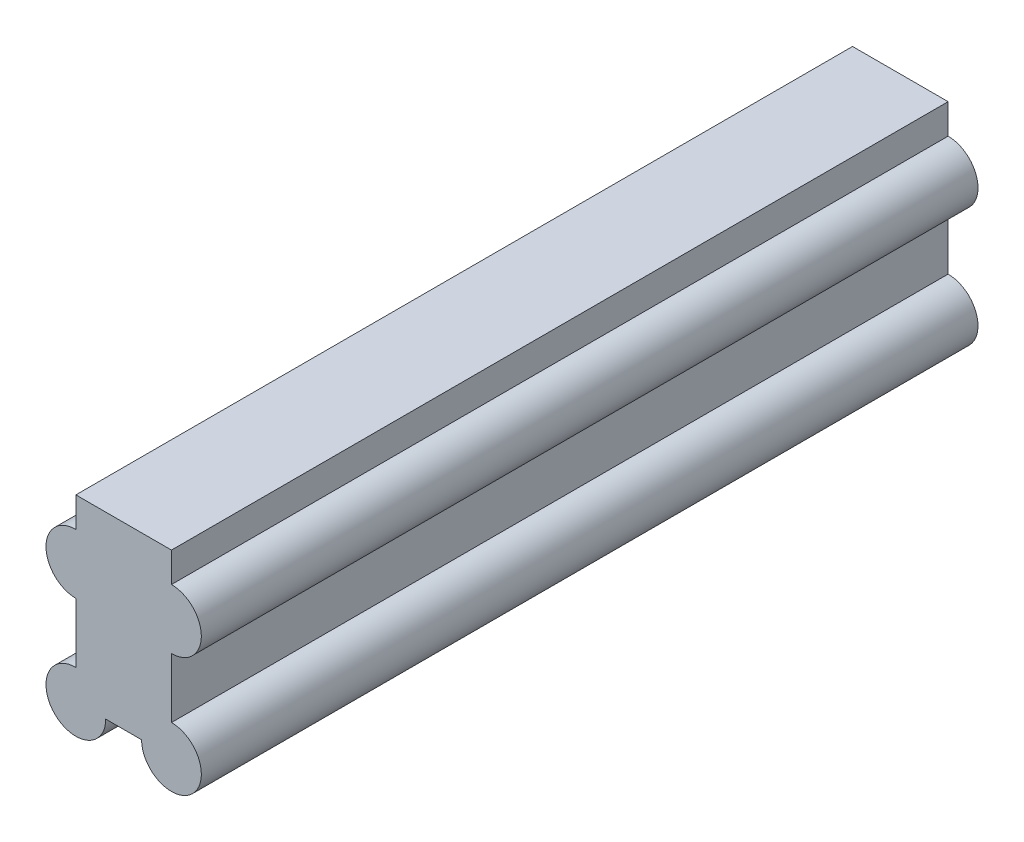
ISO-10303-21;
HEADER;
FILE_DESCRIPTION(('STEP AP214'),'2;1');
FILE_NAME('part.step','',(''),(''),'','','');
FILE_SCHEMA(('AUTOMOTIVE_DESIGN { 1 0 10303 214 1 1 1 1 }'));
ENDSEC;
DATA;
#1=APPLICATION_CONTEXT('core data for automotive mechanical design processes');
#2=APPLICATION_PROTOCOL_DEFINITION('international standard','automotive_design',2000,#1);
#3=PRODUCT_CONTEXT('',#1,'mechanical');
#4=PRODUCT('Part','Part','',(#3));
#5=PRODUCT_RELATED_PRODUCT_CATEGORY('part','',(#4));
#6=PRODUCT_DEFINITION_FORMATION('','',#4);
#7=PRODUCT_DEFINITION_CONTEXT('part definition',#1,'design');
#8=PRODUCT_DEFINITION('design','',#6,#7);
#9=PRODUCT_DEFINITION_SHAPE('','',#8);
#10=(LENGTH_UNIT() NAMED_UNIT(*) SI_UNIT(.MILLI.,.METRE.));
#11=(NAMED_UNIT(*) PLANE_ANGLE_UNIT() SI_UNIT($,.RADIAN.));
#12=(NAMED_UNIT(*) SI_UNIT($,.STERADIAN.) SOLID_ANGLE_UNIT());
#13=UNCERTAINTY_MEASURE_WITH_UNIT(LENGTH_MEASURE(1.E-05),#10,'distance_accuracy_value','');
#14=(GEOMETRIC_REPRESENTATION_CONTEXT(3) GLOBAL_UNCERTAINTY_ASSIGNED_CONTEXT((#13)) GLOBAL_UNIT_ASSIGNED_CONTEXT((#10,
#11,#12)) REPRESENTATION_CONTEXT('',''));
#15=CARTESIAN_POINT('',(0.,0.,0.));
#16=DIRECTION('',(0.,0.,1.));
#17=DIRECTION('',(1.,0.,0.));
#18=AXIS2_PLACEMENT_3D('',#15,#16,#17);
#19=CARTESIAN_POINT('',(0.,-15.,-65.));
#20=DIRECTION('',(0.,1.,0.));
#21=DIRECTION('',(-1.,0.,0.));
#22=AXIS2_PLACEMENT_3D('',#19,#20,#21);
#23=PLANE('',#22);
#24=DIRECTION('',(-1.,0.,0.));
#25=VECTOR('',#24,1.);
#26=CARTESIAN_POINT('',(0.,-15.,65.));
#27=LINE('',#26,#25);
#28=CARTESIAN_POINT('',(3.,-15.,65.));
#29=VERTEX_POINT('',#28);
#30=CARTESIAN_POINT('',(-3.,-15.,65.));
#31=VERTEX_POINT('',#30);
#32=EDGE_CURVE('E182',#29,#31,#27,.T.);
#33=ORIENTED_EDGE('',*,*,#32,.T.);
#34=DIRECTION('',(0.,0.,1.));
#35=VECTOR('',#34,1.);
#36=CARTESIAN_POINT('',(-3.,-15.,-65.));
#37=LINE('',#36,#35);
#38=CARTESIAN_POINT('',(-3.,-15.,-65.));
#39=VERTEX_POINT('',#38);
#40=EDGE_CURVE('E11',#39,#31,#37,.T.);
#41=ORIENTED_EDGE('',*,*,#40,.F.);
#42=DIRECTION('',(-1.,0.,0.));
#43=VECTOR('',#42,1.);
#44=CARTESIAN_POINT('',(0.,-15.,-65.));
#45=LINE('',#44,#43);
#46=CARTESIAN_POINT('',(3.,-15.,-65.));
#47=VERTEX_POINT('',#46);
#48=EDGE_CURVE('E154',#47,#39,#45,.T.);
#49=ORIENTED_EDGE('',*,*,#48,.F.);
#50=DIRECTION('',(0.,0.,1.));
#51=VECTOR('',#50,1.);
#52=CARTESIAN_POINT('',(3.,-15.,-65.));
#53=LINE('',#52,#51);
#54=EDGE_CURVE('E40',#47,#29,#53,.T.);
#55=ORIENTED_EDGE('',*,*,#54,.T.);
#56=EDGE_LOOP('',(#33,#41,#49,#55));
#57=FACE_BOUND('',#56,.T.);
#58=ADVANCED_FACE('F37',(#57),#23,.F.);
#59=CARTESIAN_POINT('',(-8.,-15.,-65.));
#60=DIRECTION('',(0.,0.,1.));
#61=DIRECTION('',(1.,0.,0.));
#62=AXIS2_PLACEMENT_3D('',#59,#60,#61);
#63=CYLINDRICAL_SURFACE('',#62,5.);
#64=CARTESIAN_POINT('',(-8.,-15.,65.));
#65=DIRECTION('',(0.,0.,1.));
#66=DIRECTION('',(1.,0.,0.));
#67=AXIS2_PLACEMENT_3D('',#64,#65,#66);
#68=CIRCLE('',#67,5.);
#69=CARTESIAN_POINT('',(-8.,-9.99999999999999,65.));
#70=VERTEX_POINT('',#69);
#71=EDGE_CURVE('E94',#31,#70,#68,.F.);
#72=ORIENTED_EDGE('',*,*,#71,.T.);
#73=DIRECTION('',(0.,0.,1.));
#74=VECTOR('',#73,1.);
#75=CARTESIAN_POINT('',(-8.,-9.99999999999999,-65.));
#76=LINE('',#75,#74);
#77=CARTESIAN_POINT('',(-8.,-9.99999999999999,-65.));
#78=VERTEX_POINT('',#77);
#79=EDGE_CURVE('E46',#78,#70,#76,.T.);
#80=ORIENTED_EDGE('',*,*,#79,.F.);
#81=CARTESIAN_POINT('',(-8.,-15.,-65.));
#82=DIRECTION('',(0.,0.,1.));
#83=DIRECTION('',(1.,0.,0.));
#84=AXIS2_PLACEMENT_3D('',#81,#82,#83);
#85=CIRCLE('',#84,5.);
#86=EDGE_CURVE('E54',#39,#78,#85,.F.);
#87=ORIENTED_EDGE('',*,*,#86,.F.);
#88=ORIENTED_EDGE('',*,*,#40,.T.);
#89=EDGE_LOOP('',(#72,#80,#87,#88));
#90=FACE_BOUND('',#89,.T.);
#91=ADVANCED_FACE('F223',(#90),#63,.T.);
#92=CARTESIAN_POINT('',(-8.,0.,-65.));
#93=DIRECTION('',(-1.,0.,0.));
#94=DIRECTION('',(0.,0.,1.));
#95=AXIS2_PLACEMENT_3D('',#92,#93,#94);
#96=PLANE('',#95);
#97=DIRECTION('',(0.,-1.,0.));
#98=VECTOR('',#97,1.);
#99=CARTESIAN_POINT('',(-8.,0.,65.));
#100=LINE('',#99,#98);
#101=CARTESIAN_POINT('',(-8.,0.,65.));
#102=VERTEX_POINT('',#101);
#103=EDGE_CURVE('E125',#102,#70,#100,.T.);
#104=ORIENTED_EDGE('',*,*,#103,.F.);
#105=DIRECTION('',(0.,0.,1.));
#106=VECTOR('',#105,1.);
#107=CARTESIAN_POINT('',(-8.,0.,-65.));
#108=LINE('',#107,#106);
#109=CARTESIAN_POINT('',(-8.,0.,-65.));
#110=VERTEX_POINT('',#109);
#111=EDGE_CURVE('E120',#110,#102,#108,.T.);
#112=ORIENTED_EDGE('',*,*,#111,.F.);
#113=DIRECTION('',(0.,-1.,0.));
#114=VECTOR('',#113,1.);
#115=CARTESIAN_POINT('',(-8.,0.,-65.));
#116=LINE('',#115,#114);
#117=EDGE_CURVE('E124',#110,#78,#116,.T.);
#118=ORIENTED_EDGE('',*,*,#117,.T.);
#119=ORIENTED_EDGE('',*,*,#79,.T.);
#120=EDGE_LOOP('',(#104,#112,#118,#119));
#121=FACE_BOUND('',#120,.T.);
#122=ADVANCED_FACE('F122',(#121),#96,.T.);
#123=CARTESIAN_POINT('',(-8.,5.,-65.));
#124=DIRECTION('',(0.,0.,1.));
#125=DIRECTION('',(1.,0.,0.));
#126=AXIS2_PLACEMENT_3D('',#123,#124,#125);
#127=CYLINDRICAL_SURFACE('',#126,5.);
#128=CARTESIAN_POINT('',(-8.,5.,65.));
#129=DIRECTION('',(0.,0.,1.));
#130=DIRECTION('',(1.,0.,0.));
#131=AXIS2_PLACEMENT_3D('',#128,#129,#130);
#132=CIRCLE('',#131,5.);
#133=CARTESIAN_POINT('',(-8.,10.,65.));
#134=VERTEX_POINT('',#133);
#135=EDGE_CURVE('E158',#102,#134,#132,.F.);
#136=ORIENTED_EDGE('',*,*,#135,.T.);
#137=DIRECTION('',(0.,0.,1.));
#138=VECTOR('',#137,1.);
#139=CARTESIAN_POINT('',(-8.,10.,-65.));
#140=LINE('',#139,#138);
#141=CARTESIAN_POINT('',(-8.,10.,-65.));
#142=VERTEX_POINT('',#141);
#143=EDGE_CURVE('E129',#142,#134,#140,.T.);
#144=ORIENTED_EDGE('',*,*,#143,.F.);
#145=CARTESIAN_POINT('',(-8.,5.,-65.));
#146=DIRECTION('',(0.,0.,1.));
#147=DIRECTION('',(1.,0.,0.));
#148=AXIS2_PLACEMENT_3D('',#145,#146,#147);
#149=CIRCLE('',#148,5.);
#150=EDGE_CURVE('E132',#110,#142,#149,.F.);
#151=ORIENTED_EDGE('',*,*,#150,.F.);
#152=ORIENTED_EDGE('',*,*,#111,.T.);
#153=EDGE_LOOP('',(#136,#144,#151,#152));
#154=FACE_BOUND('',#153,.T.);
#155=ADVANCED_FACE('F133',(#154),#127,.T.);
#156=CARTESIAN_POINT('',(-8.,15.,65.));
#157=VERTEX_POINT('',#156);
#158=EDGE_CURVE('E160',#157,#134,#100,.T.);
#159=ORIENTED_EDGE('',*,*,#158,.F.);
#160=DIRECTION('',(0.,0.,1.));
#161=VECTOR('',#160,1.);
#162=CARTESIAN_POINT('',(-8.,15.,-65.));
#163=LINE('',#162,#161);
#164=CARTESIAN_POINT('',(-8.,15.,-65.));
#165=VERTEX_POINT('',#164);
#166=EDGE_CURVE('E165',#165,#157,#163,.T.);
#167=ORIENTED_EDGE('',*,*,#166,.F.);
#168=EDGE_CURVE('E136',#165,#142,#116,.T.);
#169=ORIENTED_EDGE('',*,*,#168,.T.);
#170=ORIENTED_EDGE('',*,*,#143,.T.);
#171=EDGE_LOOP('',(#159,#167,#169,#170));
#172=FACE_BOUND('',#171,.T.);
#173=ADVANCED_FACE('F200',(#172),#96,.T.);
#174=CARTESIAN_POINT('',(0.,15.,-65.));
#175=DIRECTION('',(0.,1.,0.));
#176=DIRECTION('',(-1.,0.,0.));
#177=AXIS2_PLACEMENT_3D('',#174,#175,#176);
#178=PLANE('',#177);
#179=DIRECTION('',(-1.,0.,0.));
#180=VECTOR('',#179,1.);
#181=CARTESIAN_POINT('',(0.,15.,65.));
#182=LINE('',#181,#180);
#183=CARTESIAN_POINT('',(8.,15.,65.));
#184=VERTEX_POINT('',#183);
#185=EDGE_CURVE('E194',#184,#157,#182,.T.);
#186=ORIENTED_EDGE('',*,*,#185,.F.);
#187=DIRECTION('',(0.,0.,1.));
#188=VECTOR('',#187,1.);
#189=CARTESIAN_POINT('',(8.,15.,-65.));
#190=LINE('',#189,#188);
#191=CARTESIAN_POINT('',(8.,15.,-65.));
#192=VERTEX_POINT('',#191);
#193=EDGE_CURVE('E167',#192,#184,#190,.T.);
#194=ORIENTED_EDGE('',*,*,#193,.F.);
#195=DIRECTION('',(-1.,0.,0.));
#196=VECTOR('',#195,1.);
#197=CARTESIAN_POINT('',(0.,15.,-65.));
#198=LINE('',#197,#196);
#199=EDGE_CURVE('E142',#192,#165,#198,.T.);
#200=ORIENTED_EDGE('',*,*,#199,.T.);
#201=ORIENTED_EDGE('',*,*,#166,.T.);
#202=EDGE_LOOP('',(#186,#194,#200,#201));
#203=FACE_BOUND('',#202,.T.);
#204=ADVANCED_FACE('F236',(#203),#178,.T.);
#205=CARTESIAN_POINT('',(8.,0.,-65.));
#206=DIRECTION('',(-1.,0.,0.));
#207=DIRECTION('',(0.,0.,1.));
#208=AXIS2_PLACEMENT_3D('',#205,#206,#207);
#209=PLANE('',#208);
#210=DIRECTION('',(0.,-1.,0.));
#211=VECTOR('',#210,1.);
#212=CARTESIAN_POINT('',(8.,0.,65.));
#213=LINE('',#212,#211);
#214=CARTESIAN_POINT('',(8.,10.,65.));
#215=VERTEX_POINT('',#214);
#216=EDGE_CURVE('E192',#184,#215,#213,.T.);
#217=ORIENTED_EDGE('',*,*,#216,.T.);
#218=DIRECTION('',(0.,0.,1.));
#219=VECTOR('',#218,1.);
#220=CARTESIAN_POINT('',(8.,10.,-65.));
#221=LINE('',#220,#219);
#222=CARTESIAN_POINT('',(8.,10.,-65.));
#223=VERTEX_POINT('',#222);
#224=EDGE_CURVE('E169',#223,#215,#221,.T.);
#225=ORIENTED_EDGE('',*,*,#224,.F.);
#226=DIRECTION('',(0.,-1.,0.));
#227=VECTOR('',#226,1.);
#228=CARTESIAN_POINT('',(8.,0.,-65.));
#229=LINE('',#228,#227);
#230=EDGE_CURVE('E145',#192,#223,#229,.T.);
#231=ORIENTED_EDGE('',*,*,#230,.F.);
#232=ORIENTED_EDGE('',*,*,#193,.T.);
#233=EDGE_LOOP('',(#217,#225,#231,#232));
#234=FACE_BOUND('',#233,.T.);
#235=ADVANCED_FACE('F206',(#234),#209,.F.);
#236=CARTESIAN_POINT('',(8.,5.,-65.));
#237=DIRECTION('',(0.,0.,1.));
#238=DIRECTION('',(1.,0.,0.));
#239=AXIS2_PLACEMENT_3D('',#236,#237,#238);
#240=CYLINDRICAL_SURFACE('',#239,5.);
#241=CARTESIAN_POINT('',(8.,5.,65.));
#242=DIRECTION('',(0.,0.,1.));
#243=DIRECTION('',(1.,0.,0.));
#244=AXIS2_PLACEMENT_3D('',#241,#242,#243);
#245=CIRCLE('',#244,5.);
#246=CARTESIAN_POINT('',(8.,0.,65.));
#247=VERTEX_POINT('',#246);
#248=EDGE_CURVE('E191',#215,#247,#245,.F.);
#249=ORIENTED_EDGE('',*,*,#248,.T.);
#250=DIRECTION('',(0.,0.,1.));
#251=VECTOR('',#250,1.);
#252=CARTESIAN_POINT('',(8.,0.,-65.));
#253=LINE('',#252,#251);
#254=CARTESIAN_POINT('',(8.,0.,-65.));
#255=VERTEX_POINT('',#254);
#256=EDGE_CURVE('E172',#255,#247,#253,.T.);
#257=ORIENTED_EDGE('',*,*,#256,.F.);
#258=CARTESIAN_POINT('',(8.,5.,-65.));
#259=DIRECTION('',(0.,0.,1.));
#260=DIRECTION('',(1.,0.,0.));
#261=AXIS2_PLACEMENT_3D('',#258,#259,#260);
#262=CIRCLE('',#261,5.);
#263=EDGE_CURVE('E148',#223,#255,#262,.F.);
#264=ORIENTED_EDGE('',*,*,#263,.F.);
#265=ORIENTED_EDGE('',*,*,#224,.T.);
#266=EDGE_LOOP('',(#249,#257,#264,#265));
#267=FACE_BOUND('',#266,.T.);
#268=ADVANCED_FACE('F209',(#267),#240,.T.);
#269=CARTESIAN_POINT('',(8.,-10.,65.));
#270=VERTEX_POINT('',#269);
#271=EDGE_CURVE('E187',#247,#270,#213,.T.);
#272=ORIENTED_EDGE('',*,*,#271,.T.);
#273=DIRECTION('',(0.,0.,1.));
#274=VECTOR('',#273,1.);
#275=CARTESIAN_POINT('',(8.,-10.,-65.));
#276=LINE('',#275,#274);
#277=CARTESIAN_POINT('',(8.,-10.,-65.));
#278=VERTEX_POINT('',#277);
#279=EDGE_CURVE('E174',#278,#270,#276,.T.);
#280=ORIENTED_EDGE('',*,*,#279,.F.);
#281=EDGE_CURVE('E150',#255,#278,#229,.T.);
#282=ORIENTED_EDGE('',*,*,#281,.F.);
#283=ORIENTED_EDGE('',*,*,#256,.T.);
#284=EDGE_LOOP('',(#272,#280,#282,#283));
#285=FACE_BOUND('',#284,.T.);
#286=ADVANCED_FACE('F212',(#285),#209,.F.);
#287=CARTESIAN_POINT('',(8.,-15.,-65.));
#288=DIRECTION('',(0.,0.,1.));
#289=DIRECTION('',(1.,0.,0.));
#290=AXIS2_PLACEMENT_3D('',#287,#288,#289);
#291=CYLINDRICAL_SURFACE('',#290,5.);
#292=CARTESIAN_POINT('',(8.,-15.,65.));
#293=DIRECTION('',(0.,0.,1.));
#294=DIRECTION('',(1.,0.,0.));
#295=AXIS2_PLACEMENT_3D('',#292,#293,#294);
#296=CIRCLE('',#295,5.);
#297=EDGE_CURVE('E185',#270,#29,#296,.F.);
#298=ORIENTED_EDGE('',*,*,#297,.T.);
#299=ORIENTED_EDGE('',*,*,#54,.F.);
#300=CARTESIAN_POINT('',(8.,-15.,-65.));
#301=DIRECTION('',(0.,0.,1.));
#302=DIRECTION('',(1.,0.,0.));
#303=AXIS2_PLACEMENT_3D('',#300,#301,#302);
#304=CIRCLE('',#303,5.);
#305=EDGE_CURVE('E101',#278,#47,#304,.F.);
#306=ORIENTED_EDGE('',*,*,#305,.F.);
#307=ORIENTED_EDGE('',*,*,#279,.T.);
#308=EDGE_LOOP('',(#298,#299,#306,#307));
#309=FACE_BOUND('',#308,.T.);
#310=ADVANCED_FACE('F213',(#309),#291,.T.);
#311=CARTESIAN_POINT('',(0.,0.,-65.));
#312=DIRECTION('',(0.,0.,1.));
#313=DIRECTION('',(1.,0.,0.));
#314=AXIS2_PLACEMENT_3D('',#311,#312,#313);
#315=PLANE('',#314);
#316=ORIENTED_EDGE('',*,*,#48,.T.);
#317=ORIENTED_EDGE('',*,*,#86,.T.);
#318=ORIENTED_EDGE('',*,*,#117,.F.);
#319=ORIENTED_EDGE('',*,*,#150,.T.);
#320=ORIENTED_EDGE('',*,*,#168,.F.);
#321=ORIENTED_EDGE('',*,*,#199,.F.);
#322=ORIENTED_EDGE('',*,*,#230,.T.);
#323=ORIENTED_EDGE('',*,*,#263,.T.);
#324=ORIENTED_EDGE('',*,*,#281,.T.);
#325=ORIENTED_EDGE('',*,*,#305,.T.);
#326=EDGE_LOOP('',(#316,#317,#318,#319,#320,#321,#322,#323,#324,#325));
#327=FACE_BOUND('',#326,.T.);
#328=ADVANCED_FACE('F138',(#327),#315,.F.);
#329=CARTESIAN_POINT('',(0.,0.,65.));
#330=DIRECTION('',(0.,0.,1.));
#331=DIRECTION('',(1.,0.,0.));
#332=AXIS2_PLACEMENT_3D('',#329,#330,#331);
#333=PLANE('',#332);
#334=ORIENTED_EDGE('',*,*,#32,.F.);
#335=ORIENTED_EDGE('',*,*,#297,.F.);
#336=ORIENTED_EDGE('',*,*,#271,.F.);
#337=ORIENTED_EDGE('',*,*,#248,.F.);
#338=ORIENTED_EDGE('',*,*,#216,.F.);
#339=ORIENTED_EDGE('',*,*,#185,.T.);
#340=ORIENTED_EDGE('',*,*,#158,.T.);
#341=ORIENTED_EDGE('',*,*,#135,.F.);
#342=ORIENTED_EDGE('',*,*,#103,.T.);
#343=ORIENTED_EDGE('',*,*,#71,.F.);
#344=EDGE_LOOP('',(#334,#335,#336,#337,#338,#339,#340,#341,#342,#343));
#345=FACE_BOUND('',#344,.T.);
#346=ADVANCED_FACE('F183',(#345),#333,.T.);
#347=CLOSED_SHELL('',(#58,#91,#122,#155,#173,#204,#235,#268,#286,#310,#328,#346));
#348=MANIFOLD_SOLID_BREP('B2',#347);
#349=ADVANCED_BREP_SHAPE_REPRESENTATION('',(#18,#348),#14);
#350=SHAPE_DEFINITION_REPRESENTATION(#9,#349);
ENDSEC;
END-ISO-10303-21;
